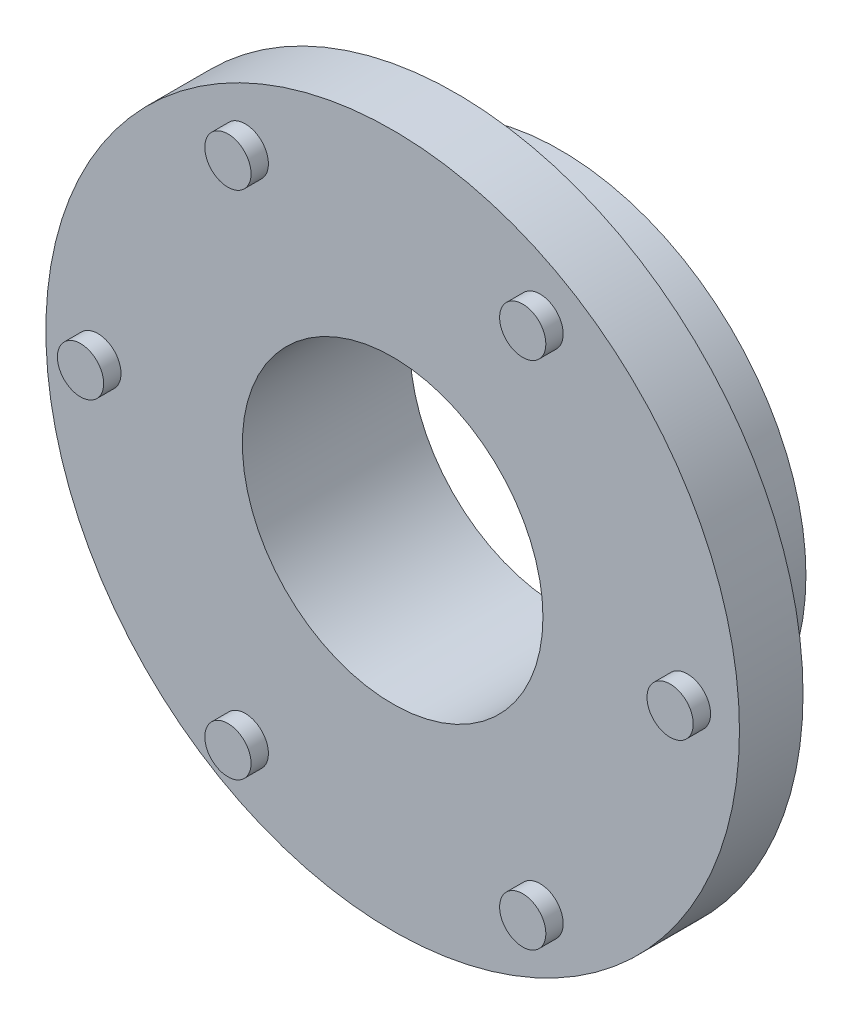
ISO-10303-21;
HEADER;
FILE_DESCRIPTION(('STEP AP214'),'2;1');
FILE_NAME('part.step','',(''),(''),'','','');
FILE_SCHEMA(('AUTOMOTIVE_DESIGN { 1 0 10303 214 1 1 1 1 }'));
ENDSEC;
DATA;
#1=APPLICATION_CONTEXT('core data for automotive mechanical design processes');
#2=APPLICATION_PROTOCOL_DEFINITION('international standard','automotive_design',2000,#1);
#3=PRODUCT_CONTEXT('',#1,'mechanical');
#4=PRODUCT('Part','Part','',(#3));
#5=PRODUCT_RELATED_PRODUCT_CATEGORY('part','',(#4));
#6=PRODUCT_DEFINITION_FORMATION('','',#4);
#7=PRODUCT_DEFINITION_CONTEXT('part definition',#1,'design');
#8=PRODUCT_DEFINITION('design','',#6,#7);
#9=PRODUCT_DEFINITION_SHAPE('','',#8);
#10=(LENGTH_UNIT() NAMED_UNIT(*) SI_UNIT(.MILLI.,.METRE.));
#11=(NAMED_UNIT(*) PLANE_ANGLE_UNIT() SI_UNIT($,.RADIAN.));
#12=(NAMED_UNIT(*) SI_UNIT($,.STERADIAN.) SOLID_ANGLE_UNIT());
#13=UNCERTAINTY_MEASURE_WITH_UNIT(LENGTH_MEASURE(1.E-05),#10,'distance_accuracy_value','');
#14=(GEOMETRIC_REPRESENTATION_CONTEXT(3) GLOBAL_UNCERTAINTY_ASSIGNED_CONTEXT((#13)) GLOBAL_UNIT_ASSIGNED_CONTEXT((#10,
#11,#12)) REPRESENTATION_CONTEXT('',''));
#15=CARTESIAN_POINT('',(0.,0.,0.));
#16=DIRECTION('',(0.,0.,1.));
#17=DIRECTION('',(1.,0.,0.));
#18=AXIS2_PLACEMENT_3D('',#15,#16,#17);
#19=CARTESIAN_POINT('',(0.,0.,-58.));
#20=DIRECTION('',(0.,0.,1.));
#21=DIRECTION('',(1.,0.,0.));
#22=AXIS2_PLACEMENT_3D('',#19,#20,#21);
#23=CYLINDRICAL_SURFACE('',#22,85.);
#24=CARTESIAN_POINT('',(0.,0.,-58.));
#25=DIRECTION('',(0.,0.,1.));
#26=DIRECTION('',(1.,0.,0.));
#27=AXIS2_PLACEMENT_3D('',#24,#25,#26);
#28=CIRCLE('',#27,85.);
#29=CARTESIAN_POINT('',(85.,0.,-58.));
#30=VERTEX_POINT('',#29);
#31=EDGE_CURVE('E10',#30,#30,#28,.T.);
#32=CARTESIAN_POINT('',(0.,0.,-22.));
#33=DIRECTION('',(0.,0.,1.));
#34=DIRECTION('',(1.,0.,0.));
#35=AXIS2_PLACEMENT_3D('',#32,#33,#34);
#36=CIRCLE('',#35,85.);
#37=CARTESIAN_POINT('',(85.,0.,-22.));
#38=VERTEX_POINT('',#37);
#39=EDGE_CURVE('E59',#38,#38,#36,.T.);
#40=CARTESIAN_POINT('',(85.,0.,-58.));
#41=CARTESIAN_POINT('',(85.,0.,-57.625));
#42=CARTESIAN_POINT('',(85.,0.,-57.25));
#43=CARTESIAN_POINT('',(85.,0.,-56.5));
#44=CARTESIAN_POINT('',(85.,0.,-56.125));
#45=CARTESIAN_POINT('',(85.,0.,-55.375));
#46=CARTESIAN_POINT('',(85.,0.,-55.));
#47=CARTESIAN_POINT('',(85.,0.,-54.25));
#48=CARTESIAN_POINT('',(85.,0.,-53.875));
#49=CARTESIAN_POINT('',(85.,0.,-53.125));
#50=CARTESIAN_POINT('',(85.,0.,-52.75));
#51=CARTESIAN_POINT('',(85.,0.,-52.));
#52=CARTESIAN_POINT('',(85.,0.,-51.625));
#53=CARTESIAN_POINT('',(85.,0.,-50.875));
#54=CARTESIAN_POINT('',(85.,0.,-50.5));
#55=CARTESIAN_POINT('',(85.,0.,-49.75));
#56=CARTESIAN_POINT('',(85.,0.,-49.375));
#57=CARTESIAN_POINT('',(85.,0.,-48.625));
#58=CARTESIAN_POINT('',(85.,0.,-48.25));
#59=CARTESIAN_POINT('',(85.,0.,-47.5));
#60=CARTESIAN_POINT('',(85.,0.,-47.125));
#61=CARTESIAN_POINT('',(85.,0.,-46.375));
#62=CARTESIAN_POINT('',(85.,0.,-46.));
#63=CARTESIAN_POINT('',(85.,0.,-45.25));
#64=CARTESIAN_POINT('',(85.,0.,-44.875));
#65=CARTESIAN_POINT('',(85.,0.,-44.125));
#66=CARTESIAN_POINT('',(85.,0.,-43.75));
#67=CARTESIAN_POINT('',(85.,0.,-43.));
#68=CARTESIAN_POINT('',(85.,0.,-42.625));
#69=CARTESIAN_POINT('',(85.,0.,-41.875));
#70=CARTESIAN_POINT('',(85.,0.,-41.5));
#71=CARTESIAN_POINT('',(85.,0.,-40.75));
#72=CARTESIAN_POINT('',(85.,0.,-40.375));
#73=CARTESIAN_POINT('',(85.,0.,-39.625));
#74=CARTESIAN_POINT('',(85.,0.,-39.25));
#75=CARTESIAN_POINT('',(85.,0.,-38.5));
#76=CARTESIAN_POINT('',(85.,0.,-38.125));
#77=CARTESIAN_POINT('',(85.,0.,-37.375));
#78=CARTESIAN_POINT('',(85.,0.,-37.));
#79=CARTESIAN_POINT('',(85.,0.,-36.25));
#80=CARTESIAN_POINT('',(85.,0.,-35.875));
#81=CARTESIAN_POINT('',(85.,0.,-35.125));
#82=CARTESIAN_POINT('',(85.,0.,-34.75));
#83=CARTESIAN_POINT('',(85.,0.,-34.));
#84=CARTESIAN_POINT('',(85.,0.,-33.625));
#85=CARTESIAN_POINT('',(85.,0.,-32.875));
#86=CARTESIAN_POINT('',(85.,0.,-32.5));
#87=CARTESIAN_POINT('',(85.,0.,-31.75));
#88=CARTESIAN_POINT('',(85.,0.,-31.375));
#89=CARTESIAN_POINT('',(85.,0.,-30.625));
#90=CARTESIAN_POINT('',(85.,0.,-30.25));
#91=CARTESIAN_POINT('',(85.,0.,-29.5));
#92=CARTESIAN_POINT('',(85.,0.,-29.125));
#93=CARTESIAN_POINT('',(85.,0.,-28.375));
#94=CARTESIAN_POINT('',(85.,0.,-28.));
#95=CARTESIAN_POINT('',(85.,0.,-27.25));
#96=CARTESIAN_POINT('',(85.,0.,-26.875));
#97=CARTESIAN_POINT('',(85.,0.,-26.125));
#98=CARTESIAN_POINT('',(85.,0.,-25.75));
#99=CARTESIAN_POINT('',(85.,0.,-25.));
#100=CARTESIAN_POINT('',(85.,0.,-24.625));
#101=CARTESIAN_POINT('',(85.,0.,-23.875));
#102=CARTESIAN_POINT('',(85.,0.,-23.5));
#103=CARTESIAN_POINT('',(85.,0.,-22.75));
#104=CARTESIAN_POINT('',(85.,0.,-22.375));
#105=CARTESIAN_POINT('',(85.,0.,-22.));
#106=B_SPLINE_CURVE_WITH_KNOTS('',3,(#40,#41,#42,#43,#44,#45,#46,#47,#48,#49,#50,#51,#52,#53,
#54,#55,#56,#57,#58,#59,#60,#61,#62,#63,#64,#65,#66,#67,#68,#69,#70,#71,#72,#73,#74,#75,#76,#77,
#78,#79,#80,#81,#82,#83,#84,#85,#86,#87,#88,#89,#90,#91,#92,#93,#94,#95,#96,#97,#98,#99,#100,
#101,#102,#103,#104,#105),.UNSPECIFIED.,.F.,.F.,(4,2,2,2,2,2,2,2,2,2,2,2,2,2,2,2,2,2,2,2,2,2,2,
2,2,2,2,2,2,2,2,2,4),(0.,1.125,2.25,3.375,4.5,5.62500000000001,6.75000000000001,
7.87500000000001,9.00000000000001,10.125,11.25,12.375,13.5,14.625,15.75,16.875,18.,19.125,20.25,
21.375,22.5,23.625,24.75,25.875,27.,28.125,29.25,30.375,31.5,32.625,33.75,34.875,36.),.UNSPECIFIED.);
#107=EDGE_CURVE('BSEAM39',#30,#38,#106,.T.);
#108=ORIENTED_EDGE('',*,*,#31,.T.);
#109=ORIENTED_EDGE('',*,*,#39,.F.);
#110=ORIENTED_EDGE('',*,*,#107,.T.);
#111=ORIENTED_EDGE('',*,*,#107,.F.);
#112=EDGE_LOOP('',(#108,#110,#109,#111));
#113=FACE_BOUND('',#112,.T.);
#114=ADVANCED_FACE('F39',(#113),#23,.T.);
#115=CARTESIAN_POINT('',(0.,0.,-58.));
#116=DIRECTION('',(0.,0.,1.));
#117=DIRECTION('',(1.,0.,0.));
#118=AXIS2_PLACEMENT_3D('',#115,#116,#117);
#119=PLANE('',#118);
#120=CARTESIAN_POINT('',(0.,0.,-58.));
#121=DIRECTION('',(0.,0.,1.));
#122=DIRECTION('',(1.,0.,0.));
#123=AXIS2_PLACEMENT_3D('',#120,#121,#122);
#124=CIRCLE('',#123,52.);
#125=CARTESIAN_POINT('',(52.,0.,-58.));
#126=VERTEX_POINT('',#125);
#127=EDGE_CURVE('E45',#126,#126,#124,.T.);
#128=ORIENTED_EDGE('',*,*,#127,.T.);
#129=EDGE_LOOP('',(#128));
#130=FACE_BOUND('',#129,.T.);
#131=ORIENTED_EDGE('',*,*,#31,.F.);
#132=EDGE_LOOP('',(#131));
#133=FACE_BOUND('',#132,.T.);
#134=ADVANCED_FACE('F107',(#130,#133),#119,.F.);
#135=CARTESIAN_POINT('',(0.,0.,0.));
#136=DIRECTION('',(0.,0.,1.));
#137=DIRECTION('',(1.,0.,0.));
#138=AXIS2_PLACEMENT_3D('',#135,#136,#137);
#139=PLANE('',#138);
#140=CARTESIAN_POINT('',(51.,-88.3345911860127,0.));
#141=DIRECTION('',(0.,0.,1.));
#142=DIRECTION('',(1.,0.,0.));
#143=AXIS2_PLACEMENT_3D('',#140,#141,#142);
#144=CIRCLE('',#143,8.);
#145=CARTESIAN_POINT('',(59.,-88.3345911860127,0.));
#146=VERTEX_POINT('',#145);
#147=EDGE_CURVE('E92',#146,#146,#144,.T.);
#148=ORIENTED_EDGE('',*,*,#147,.F.);
#149=EDGE_LOOP('',(#148));
#150=FACE_BOUND('',#149,.T.);
#151=CARTESIAN_POINT('',(-51.,-88.3345911860127,0.));
#152=DIRECTION('',(0.,0.,1.));
#153=DIRECTION('',(1.,0.,0.));
#154=AXIS2_PLACEMENT_3D('',#151,#152,#153);
#155=CIRCLE('',#154,7.99999999999993);
#156=CARTESIAN_POINT('',(-43.,-88.3345911860127,0.));
#157=VERTEX_POINT('',#156);
#158=EDGE_CURVE('E86',#157,#157,#155,.T.);
#159=ORIENTED_EDGE('',*,*,#158,.F.);
#160=EDGE_LOOP('',(#159));
#161=FACE_BOUND('',#160,.T.);
#162=CARTESIAN_POINT('',(-102.,0.,0.));
#163=DIRECTION('',(0.,0.,1.));
#164=DIRECTION('',(1.,0.,0.));
#165=AXIS2_PLACEMENT_3D('',#162,#163,#164);
#166=CIRCLE('',#165,8.);
#167=CARTESIAN_POINT('',(-94.,0.,0.));
#168=VERTEX_POINT('',#167);
#169=EDGE_CURVE('E80',#168,#168,#166,.T.);
#170=ORIENTED_EDGE('',*,*,#169,.F.);
#171=EDGE_LOOP('',(#170));
#172=FACE_BOUND('',#171,.T.);
#173=CARTESIAN_POINT('',(-51.,88.3345911860127,0.));
#174=DIRECTION('',(0.,0.,1.));
#175=DIRECTION('',(1.,0.,0.));
#176=AXIS2_PLACEMENT_3D('',#173,#174,#175);
#177=CIRCLE('',#176,8.);
#178=CARTESIAN_POINT('',(-43.,88.3345911860127,0.));
#179=VERTEX_POINT('',#178);
#180=EDGE_CURVE('E74',#179,#179,#177,.T.);
#181=ORIENTED_EDGE('',*,*,#180,.F.);
#182=EDGE_LOOP('',(#181));
#183=FACE_BOUND('',#182,.T.);
#184=CARTESIAN_POINT('',(51.,88.3345911860127,0.));
#185=DIRECTION('',(0.,0.,1.));
#186=DIRECTION('',(1.,0.,0.));
#187=AXIS2_PLACEMENT_3D('',#184,#185,#186);
#188=CIRCLE('',#187,8.);
#189=CARTESIAN_POINT('',(59.,88.3345911860127,0.));
#190=VERTEX_POINT('',#189);
#191=EDGE_CURVE('E68',#190,#190,#188,.T.);
#192=ORIENTED_EDGE('',*,*,#191,.F.);
#193=EDGE_LOOP('',(#192));
#194=FACE_BOUND('',#193,.T.);
#195=CARTESIAN_POINT('',(102.,0.,0.));
#196=DIRECTION('',(0.,0.,1.));
#197=DIRECTION('',(1.,0.,0.));
#198=AXIS2_PLACEMENT_3D('',#195,#196,#197);
#199=CIRCLE('',#198,8.);
#200=CARTESIAN_POINT('',(110.,0.,0.));
#201=VERTEX_POINT('',#200);
#202=EDGE_CURVE('E65',#201,#201,#199,.T.);
#203=ORIENTED_EDGE('',*,*,#202,.F.);
#204=EDGE_LOOP('',(#203));
#205=FACE_BOUND('',#204,.T.);
#206=CARTESIAN_POINT('',(0.,0.,0.));
#207=DIRECTION('',(0.,0.,1.));
#208=DIRECTION('',(1.,0.,0.));
#209=AXIS2_PLACEMENT_3D('',#206,#207,#208);
#210=CIRCLE('',#209,52.);
#211=CARTESIAN_POINT('',(52.,0.,0.));
#212=VERTEX_POINT('',#211);
#213=EDGE_CURVE('E49',#212,#212,#210,.T.);
#214=ORIENTED_EDGE('',*,*,#213,.F.);
#215=EDGE_LOOP('',(#214));
#216=FACE_BOUND('',#215,.T.);
#217=CARTESIAN_POINT('',(0.,0.,0.));
#218=DIRECTION('',(0.,0.,1.));
#219=DIRECTION('',(1.,0.,0.));
#220=AXIS2_PLACEMENT_3D('',#217,#218,#219);
#221=CIRCLE('',#220,120.);
#222=CARTESIAN_POINT('',(120.,0.,0.));
#223=VERTEX_POINT('',#222);
#224=EDGE_CURVE('E56',#223,#223,#221,.T.);
#225=ORIENTED_EDGE('',*,*,#224,.T.);
#226=EDGE_LOOP('',(#225));
#227=FACE_BOUND('',#226,.T.);
#228=ADVANCED_FACE('F103',(#150,#161,#172,#183,#194,#205,#216,#227),#139,.T.);
#229=CARTESIAN_POINT('',(0.,0.,-58.));
#230=DIRECTION('',(0.,0.,1.));
#231=DIRECTION('',(1.,0.,0.));
#232=AXIS2_PLACEMENT_3D('',#229,#230,#231);
#233=CYLINDRICAL_SURFACE('',#232,52.);
#234=CARTESIAN_POINT('',(52.,0.,-58.));
#235=CARTESIAN_POINT('',(52.,0.,-57.3958333333333));
#236=CARTESIAN_POINT('',(52.,0.,-56.7916666666667));
#237=CARTESIAN_POINT('',(52.,0.,-55.5833333333333));
#238=CARTESIAN_POINT('',(52.,0.,-54.9791666666667));
#239=CARTESIAN_POINT('',(52.,0.,-53.7708333333333));
#240=CARTESIAN_POINT('',(52.,0.,-53.1666666666667));
#241=CARTESIAN_POINT('',(52.,0.,-51.9583333333333));
#242=CARTESIAN_POINT('',(52.,0.,-51.3541666666667));
#243=CARTESIAN_POINT('',(52.,0.,-50.1458333333333));
#244=CARTESIAN_POINT('',(52.,0.,-49.5416666666667));
#245=CARTESIAN_POINT('',(52.,0.,-48.3333333333333));
#246=CARTESIAN_POINT('',(52.,0.,-47.7291666666667));
#247=CARTESIAN_POINT('',(52.,0.,-46.5208333333333));
#248=CARTESIAN_POINT('',(52.,0.,-45.9166666666667));
#249=CARTESIAN_POINT('',(52.,0.,-44.7083333333333));
#250=CARTESIAN_POINT('',(52.,0.,-44.1041666666667));
#251=CARTESIAN_POINT('',(52.,0.,-42.8958333333333));
#252=CARTESIAN_POINT('',(52.,0.,-42.2916666666667));
#253=CARTESIAN_POINT('',(52.,0.,-41.0833333333333));
#254=CARTESIAN_POINT('',(52.,0.,-40.4791666666667));
#255=CARTESIAN_POINT('',(52.,0.,-39.2708333333333));
#256=CARTESIAN_POINT('',(52.,0.,-38.6666666666667));
#257=CARTESIAN_POINT('',(52.,0.,-37.4583333333333));
#258=CARTESIAN_POINT('',(52.,0.,-36.8541666666667));
#259=CARTESIAN_POINT('',(52.,0.,-35.6458333333333));
#260=CARTESIAN_POINT('',(52.,0.,-35.0416666666667));
#261=CARTESIAN_POINT('',(52.,0.,-33.8333333333333));
#262=CARTESIAN_POINT('',(52.,0.,-33.2291666666667));
#263=CARTESIAN_POINT('',(52.,0.,-32.0208333333333));
#264=CARTESIAN_POINT('',(52.,0.,-31.4166666666667));
#265=CARTESIAN_POINT('',(52.,0.,-30.2083333333333));
#266=CARTESIAN_POINT('',(52.,0.,-29.6041666666667));
#267=CARTESIAN_POINT('',(52.,0.,-28.3958333333333));
#268=CARTESIAN_POINT('',(52.,0.,-27.7916666666667));
#269=CARTESIAN_POINT('',(52.,0.,-26.5833333333333));
#270=CARTESIAN_POINT('',(52.,0.,-25.9791666666667));
#271=CARTESIAN_POINT('',(52.,0.,-24.7708333333333));
#272=CARTESIAN_POINT('',(52.,0.,-24.1666666666667));
#273=CARTESIAN_POINT('',(52.,0.,-22.9583333333333));
#274=CARTESIAN_POINT('',(52.,0.,-22.3541666666667));
#275=CARTESIAN_POINT('',(52.,0.,-21.1458333333333));
#276=CARTESIAN_POINT('',(52.,0.,-20.5416666666667));
#277=CARTESIAN_POINT('',(52.,0.,-19.3333333333333));
#278=CARTESIAN_POINT('',(52.,0.,-18.7291666666667));
#279=CARTESIAN_POINT('',(52.,0.,-17.5208333333333));
#280=CARTESIAN_POINT('',(52.,0.,-16.9166666666667));
#281=CARTESIAN_POINT('',(52.,0.,-15.7083333333333));
#282=CARTESIAN_POINT('',(52.,0.,-15.1041666666667));
#283=CARTESIAN_POINT('',(52.,0.,-13.8958333333333));
#284=CARTESIAN_POINT('',(52.,0.,-13.2916666666667));
#285=CARTESIAN_POINT('',(52.,0.,-12.0833333333333));
#286=CARTESIAN_POINT('',(52.,0.,-11.4791666666667));
#287=CARTESIAN_POINT('',(52.,0.,-10.2708333333333));
#288=CARTESIAN_POINT('',(52.,0.,-9.66666666666667));
#289=CARTESIAN_POINT('',(52.,0.,-8.45833333333333));
#290=CARTESIAN_POINT('',(52.,0.,-7.85416666666667));
#291=CARTESIAN_POINT('',(52.,0.,-6.64583333333333));
#292=CARTESIAN_POINT('',(52.,0.,-6.04166666666667));
#293=CARTESIAN_POINT('',(52.,0.,-4.83333333333334));
#294=CARTESIAN_POINT('',(52.,0.,-4.22916666666667));
#295=CARTESIAN_POINT('',(52.,0.,-3.02083333333334));
#296=CARTESIAN_POINT('',(52.,0.,-2.41666666666667));
#297=CARTESIAN_POINT('',(52.,0.,-1.20833333333333));
#298=CARTESIAN_POINT('',(52.,0.,-0.604166666666667));
#299=CARTESIAN_POINT('',(52.,0.,0.));
#300=B_SPLINE_CURVE_WITH_KNOTS('',3,(#234,#235,#236,#237,#238,#239,#240,#241,#242,#243,#244,
#245,#246,#247,#248,#249,#250,#251,#252,#253,#254,#255,#256,#257,#258,#259,#260,#261,#262,#263,
#264,#265,#266,#267,#268,#269,#270,#271,#272,#273,#274,#275,#276,#277,#278,#279,#280,#281,#282,
#283,#284,#285,#286,#287,#288,#289,#290,#291,#292,#293,#294,#295,#296,#297,#298,#299),
.UNSPECIFIED.,.F.,.F.,(4,2,2,2,2,2,2,2,2,2,2,2,2,2,2,2,2,2,2,2,2,2,2,2,2,2,2,2,2,2,2,2,4),(0.,
1.8125,3.625,5.4375,7.25000000000001,9.0625,10.875,12.6875,14.5,16.3125,18.125,19.9375,21.75,
23.5625,25.375,27.1875,29.,30.8125,32.625,34.4375,36.25,38.0625,39.875,41.6875,43.5,45.3125,
47.125,48.9375,50.75,52.5625,54.375,56.1875,58.),.UNSPECIFIED.);
#301=EDGE_CURVE('BSEAM106',#126,#212,#300,.T.);
#302=ORIENTED_EDGE('',*,*,#127,.F.);
#303=ORIENTED_EDGE('',*,*,#213,.T.);
#304=ORIENTED_EDGE('',*,*,#301,.T.);
#305=ORIENTED_EDGE('',*,*,#301,.F.);
#306=EDGE_LOOP('',(#302,#304,#303,#305));
#307=FACE_BOUND('',#306,.T.);
#308=ADVANCED_FACE('F106',(#307),#233,.F.);
#309=CARTESIAN_POINT('',(0.,0.,-22.));
#310=DIRECTION('',(0.,0.,1.));
#311=DIRECTION('',(1.,0.,0.));
#312=AXIS2_PLACEMENT_3D('',#309,#310,#311);
#313=CYLINDRICAL_SURFACE('',#312,120.);
#314=CARTESIAN_POINT('',(0.,0.,-22.));
#315=DIRECTION('',(0.,0.,1.));
#316=DIRECTION('',(1.,0.,0.));
#317=AXIS2_PLACEMENT_3D('',#314,#315,#316);
#318=CIRCLE('',#317,120.);
#319=CARTESIAN_POINT('',(120.,0.,-22.));
#320=VERTEX_POINT('',#319);
#321=EDGE_CURVE('E54',#320,#320,#318,.T.);
#322=ORIENTED_EDGE('',*,*,#321,.T.);
#323=EDGE_LOOP('',(#322));
#324=FACE_BOUND('',#323,.T.);
#325=ORIENTED_EDGE('',*,*,#224,.F.);
#326=EDGE_LOOP('',(#325));
#327=FACE_BOUND('',#326,.T.);
#328=ADVANCED_FACE('F122',(#324,#327),#313,.T.);
#329=CARTESIAN_POINT('',(0.,0.,-22.));
#330=DIRECTION('',(0.,0.,1.));
#331=DIRECTION('',(1.,0.,0.));
#332=AXIS2_PLACEMENT_3D('',#329,#330,#331);
#333=PLANE('',#332);
#334=ORIENTED_EDGE('',*,*,#39,.T.);
#335=EDGE_LOOP('',(#334));
#336=FACE_BOUND('',#335,.T.);
#337=ORIENTED_EDGE('',*,*,#321,.F.);
#338=EDGE_LOOP('',(#337));
#339=FACE_BOUND('',#338,.T.);
#340=ADVANCED_FACE('F124',(#336,#339),#333,.F.);
#341=CARTESIAN_POINT('',(102.,0.,6.));
#342=DIRECTION('',(0.,0.,-1.));
#343=DIRECTION('',(-1.,0.,0.));
#344=AXIS2_PLACEMENT_3D('',#341,#342,#343);
#345=CYLINDRICAL_SURFACE('',#344,8.);
#346=CARTESIAN_POINT('',(102.,0.,6.));
#347=DIRECTION('',(0.,0.,1.));
#348=DIRECTION('',(1.,0.,0.));
#349=AXIS2_PLACEMENT_3D('',#346,#347,#348);
#350=CIRCLE('',#349,8.);
#351=CARTESIAN_POINT('',(110.,0.,6.));
#352=VERTEX_POINT('',#351);
#353=EDGE_CURVE('E64',#352,#352,#350,.T.);
#354=ORIENTED_EDGE('',*,*,#353,.F.);
#355=EDGE_LOOP('',(#354));
#356=FACE_BOUND('',#355,.T.);
#357=ORIENTED_EDGE('',*,*,#202,.T.);
#358=EDGE_LOOP('',(#357));
#359=FACE_BOUND('',#358,.T.);
#360=ADVANCED_FACE('F131',(#356,#359),#345,.T.);
#361=CARTESIAN_POINT('',(102.,0.,6.));
#362=DIRECTION('',(0.,0.,1.));
#363=DIRECTION('',(1.,0.,0.));
#364=AXIS2_PLACEMENT_3D('',#361,#362,#363);
#365=PLANE('',#364);
#366=ORIENTED_EDGE('',*,*,#353,.T.);
#367=EDGE_LOOP('',(#366));
#368=FACE_BOUND('',#367,.T.);
#369=ADVANCED_FACE('F185',(#368),#365,.T.);
#370=CARTESIAN_POINT('',(51.,88.3345911860127,6.));
#371=DIRECTION('',(0.,0.,-1.));
#372=DIRECTION('',(-1.,0.,0.));
#373=AXIS2_PLACEMENT_3D('',#370,#371,#372);
#374=CYLINDRICAL_SURFACE('',#373,8.);
#375=CARTESIAN_POINT('',(51.,88.3345911860127,6.));
#376=DIRECTION('',(0.,0.,1.));
#377=DIRECTION('',(1.,0.,0.));
#378=AXIS2_PLACEMENT_3D('',#375,#376,#377);
#379=CIRCLE('',#378,8.);
#380=CARTESIAN_POINT('',(59.,88.3345911860127,6.));
#381=VERTEX_POINT('',#380);
#382=EDGE_CURVE('E71',#381,#381,#379,.T.);
#383=ORIENTED_EDGE('',*,*,#382,.F.);
#384=EDGE_LOOP('',(#383));
#385=FACE_BOUND('',#384,.T.);
#386=ORIENTED_EDGE('',*,*,#191,.T.);
#387=EDGE_LOOP('',(#386));
#388=FACE_BOUND('',#387,.T.);
#389=ADVANCED_FACE('F195',(#385,#388),#374,.T.);
#390=CARTESIAN_POINT('',(51.,88.3345911860127,6.));
#391=DIRECTION('',(0.,0.,1.));
#392=DIRECTION('',(1.,0.,0.));
#393=AXIS2_PLACEMENT_3D('',#390,#391,#392);
#394=PLANE('',#393);
#395=ORIENTED_EDGE('',*,*,#382,.T.);
#396=EDGE_LOOP('',(#395));
#397=FACE_BOUND('',#396,.T.);
#398=ADVANCED_FACE('F205',(#397),#394,.T.);
#399=CARTESIAN_POINT('',(-51.,88.3345911860127,6.));
#400=DIRECTION('',(0.,0.,-1.));
#401=DIRECTION('',(-1.,0.,0.));
#402=AXIS2_PLACEMENT_3D('',#399,#400,#401);
#403=CYLINDRICAL_SURFACE('',#402,8.);
#404=CARTESIAN_POINT('',(-51.,88.3345911860127,6.));
#405=DIRECTION('',(0.,0.,1.));
#406=DIRECTION('',(1.,0.,0.));
#407=AXIS2_PLACEMENT_3D('',#404,#405,#406);
#408=CIRCLE('',#407,8.);
#409=CARTESIAN_POINT('',(-43.,88.3345911860127,6.));
#410=VERTEX_POINT('',#409);
#411=EDGE_CURVE('E77',#410,#410,#408,.T.);
#412=ORIENTED_EDGE('',*,*,#411,.F.);
#413=EDGE_LOOP('',(#412));
#414=FACE_BOUND('',#413,.T.);
#415=ORIENTED_EDGE('',*,*,#180,.T.);
#416=EDGE_LOOP('',(#415));
#417=FACE_BOUND('',#416,.T.);
#418=ADVANCED_FACE('F215',(#414,#417),#403,.T.);
#419=CARTESIAN_POINT('',(-51.,88.3345911860127,6.));
#420=DIRECTION('',(0.,0.,1.));
#421=DIRECTION('',(1.,0.,0.));
#422=AXIS2_PLACEMENT_3D('',#419,#420,#421);
#423=PLANE('',#422);
#424=ORIENTED_EDGE('',*,*,#411,.T.);
#425=EDGE_LOOP('',(#424));
#426=FACE_BOUND('',#425,.T.);
#427=ADVANCED_FACE('F225',(#426),#423,.T.);
#428=CARTESIAN_POINT('',(-102.,0.,6.));
#429=DIRECTION('',(0.,0.,-1.));
#430=DIRECTION('',(-1.,0.,0.));
#431=AXIS2_PLACEMENT_3D('',#428,#429,#430);
#432=CYLINDRICAL_SURFACE('',#431,8.);
#433=CARTESIAN_POINT('',(-102.,0.,6.));
#434=DIRECTION('',(0.,0.,1.));
#435=DIRECTION('',(1.,0.,0.));
#436=AXIS2_PLACEMENT_3D('',#433,#434,#435);
#437=CIRCLE('',#436,8.);
#438=CARTESIAN_POINT('',(-94.,0.,6.));
#439=VERTEX_POINT('',#438);
#440=EDGE_CURVE('E83',#439,#439,#437,.T.);
#441=ORIENTED_EDGE('',*,*,#440,.F.);
#442=EDGE_LOOP('',(#441));
#443=FACE_BOUND('',#442,.T.);
#444=ORIENTED_EDGE('',*,*,#169,.T.);
#445=EDGE_LOOP('',(#444));
#446=FACE_BOUND('',#445,.T.);
#447=ADVANCED_FACE('F235',(#443,#446),#432,.T.);
#448=CARTESIAN_POINT('',(-102.,0.,6.));
#449=DIRECTION('',(0.,0.,1.));
#450=DIRECTION('',(1.,0.,0.));
#451=AXIS2_PLACEMENT_3D('',#448,#449,#450);
#452=PLANE('',#451);
#453=ORIENTED_EDGE('',*,*,#440,.T.);
#454=EDGE_LOOP('',(#453));
#455=FACE_BOUND('',#454,.T.);
#456=ADVANCED_FACE('F245',(#455),#452,.T.);
#457=CARTESIAN_POINT('',(-51.,-88.3345911860127,6.));
#458=DIRECTION('',(0.,0.,-1.));
#459=DIRECTION('',(-1.,0.,0.));
#460=AXIS2_PLACEMENT_3D('',#457,#458,#459);
#461=CYLINDRICAL_SURFACE('',#460,7.99999999999993);
#462=CARTESIAN_POINT('',(-51.,-88.3345911860127,6.));
#463=DIRECTION('',(0.,0.,1.));
#464=DIRECTION('',(1.,0.,0.));
#465=AXIS2_PLACEMENT_3D('',#462,#463,#464);
#466=CIRCLE('',#465,7.99999999999993);
#467=CARTESIAN_POINT('',(-43.,-88.3345911860127,6.));
#468=VERTEX_POINT('',#467);
#469=EDGE_CURVE('E89',#468,#468,#466,.T.);
#470=ORIENTED_EDGE('',*,*,#469,.F.);
#471=EDGE_LOOP('',(#470));
#472=FACE_BOUND('',#471,.T.);
#473=ORIENTED_EDGE('',*,*,#158,.T.);
#474=EDGE_LOOP('',(#473));
#475=FACE_BOUND('',#474,.T.);
#476=ADVANCED_FACE('F255',(#472,#475),#461,.T.);
#477=CARTESIAN_POINT('',(-51.,-88.3345911860127,6.));
#478=DIRECTION('',(0.,0.,1.));
#479=DIRECTION('',(1.,0.,0.));
#480=AXIS2_PLACEMENT_3D('',#477,#478,#479);
#481=PLANE('',#480);
#482=ORIENTED_EDGE('',*,*,#469,.T.);
#483=EDGE_LOOP('',(#482));
#484=FACE_BOUND('',#483,.T.);
#485=ADVANCED_FACE('F265',(#484),#481,.T.);
#486=CARTESIAN_POINT('',(51.,-88.3345911860127,6.));
#487=DIRECTION('',(0.,0.,-1.));
#488=DIRECTION('',(-1.,0.,0.));
#489=AXIS2_PLACEMENT_3D('',#486,#487,#488);
#490=CYLINDRICAL_SURFACE('',#489,8.);
#491=CARTESIAN_POINT('',(51.,-88.3345911860127,6.));
#492=DIRECTION('',(0.,0.,1.));
#493=DIRECTION('',(1.,0.,0.));
#494=AXIS2_PLACEMENT_3D('',#491,#492,#493);
#495=CIRCLE('',#494,8.);
#496=CARTESIAN_POINT('',(59.,-88.3345911860127,6.));
#497=VERTEX_POINT('',#496);
#498=EDGE_CURVE('E95',#497,#497,#495,.T.);
#499=ORIENTED_EDGE('',*,*,#498,.F.);
#500=EDGE_LOOP('',(#499));
#501=FACE_BOUND('',#500,.T.);
#502=ORIENTED_EDGE('',*,*,#147,.T.);
#503=EDGE_LOOP('',(#502));
#504=FACE_BOUND('',#503,.T.);
#505=ADVANCED_FACE('F101',(#501,#504),#490,.T.);
#506=CARTESIAN_POINT('',(51.,-88.3345911860127,6.));
#507=DIRECTION('',(0.,0.,1.));
#508=DIRECTION('',(1.,0.,0.));
#509=AXIS2_PLACEMENT_3D('',#506,#507,#508);
#510=PLANE('',#509);
#511=ORIENTED_EDGE('',*,*,#498,.T.);
#512=EDGE_LOOP('',(#511));
#513=FACE_BOUND('',#512,.T.);
#514=ADVANCED_FACE('F284',(#513),#510,.T.);
#515=CLOSED_SHELL('',(#114,#134,#228,#308,#328,#340,#360,#369,#389,#398,#418,#427,#447,#456,
#476,#485,#505,#514));
#516=MANIFOLD_SOLID_BREP('B2',#515);
#517=ADVANCED_BREP_SHAPE_REPRESENTATION('',(#18,#516),#14);
#518=SHAPE_DEFINITION_REPRESENTATION(#9,#517);
ENDSEC;
END-ISO-10303-21;
